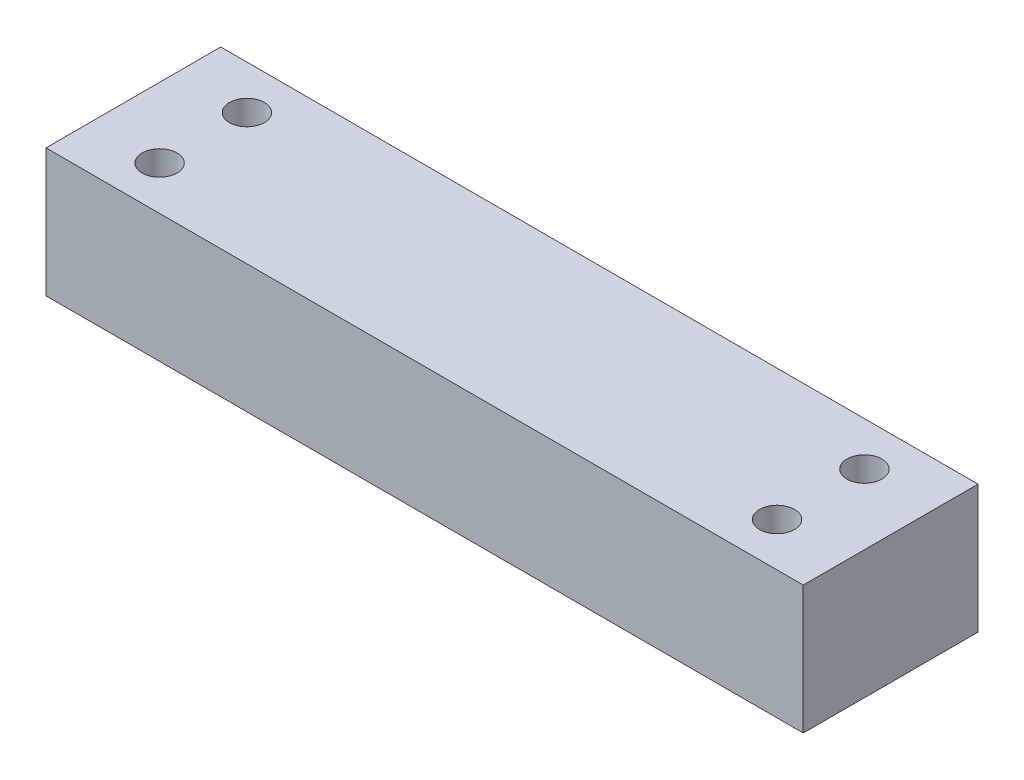
ISO-10303-21;
HEADER;
FILE_DESCRIPTION(('STEP AP214'),'2;1');
FILE_NAME('part.step','',(''),(''),'','','');
FILE_SCHEMA(('AUTOMOTIVE_DESIGN { 1 0 10303 214 1 1 1 1 }'));
ENDSEC;
DATA;
#1=APPLICATION_CONTEXT('core data for automotive mechanical design processes');
#2=APPLICATION_PROTOCOL_DEFINITION('international standard','automotive_design',2000,#1);
#3=PRODUCT_CONTEXT('',#1,'mechanical');
#4=PRODUCT('Part','Part','',(#3));
#5=PRODUCT_RELATED_PRODUCT_CATEGORY('part','',(#4));
#6=PRODUCT_DEFINITION_FORMATION('','',#4);
#7=PRODUCT_DEFINITION_CONTEXT('part definition',#1,'design');
#8=PRODUCT_DEFINITION('design','',#6,#7);
#9=PRODUCT_DEFINITION_SHAPE('','',#8);
#10=(LENGTH_UNIT() NAMED_UNIT(*) SI_UNIT(.MILLI.,.METRE.));
#11=(NAMED_UNIT(*) PLANE_ANGLE_UNIT() SI_UNIT($,.RADIAN.));
#12=(NAMED_UNIT(*) SI_UNIT($,.STERADIAN.) SOLID_ANGLE_UNIT());
#13=UNCERTAINTY_MEASURE_WITH_UNIT(LENGTH_MEASURE(1.E-05),#10,'distance_accuracy_value','');
#14=(GEOMETRIC_REPRESENTATION_CONTEXT(3) GLOBAL_UNCERTAINTY_ASSIGNED_CONTEXT((#13)) GLOBAL_UNIT_ASSIGNED_CONTEXT((#10,
#11,#12)) REPRESENTATION_CONTEXT('',''));
#15=CARTESIAN_POINT('',(0.,0.,0.));
#16=DIRECTION('',(0.,0.,1.));
#17=DIRECTION('',(1.,0.,0.));
#18=AXIS2_PLACEMENT_3D('',#15,#16,#17);
#19=CARTESIAN_POINT('',(0.,22.,0.));
#20=DIRECTION('',(0.,1.,0.));
#21=DIRECTION('',(0.,0.,1.));
#22=AXIS2_PLACEMENT_3D('',#19,#20,#21);
#23=PLANE('',#22);
#24=CARTESIAN_POINT('',(53.,22.,-7.5));
#25=DIRECTION('',(0.,1.,0.));
#26=DIRECTION('',(0.,0.,1.));
#27=AXIS2_PLACEMENT_3D('',#24,#25,#26);
#28=CIRCLE('',#27,3.);
#29=CARTESIAN_POINT('',(53.,22.,-4.5));
#30=VERTEX_POINT('',#29);
#31=EDGE_CURVE('E121',#30,#30,#28,.T.);
#32=ORIENTED_EDGE('',*,*,#31,.F.);
#33=EDGE_LOOP('',(#32));
#34=FACE_BOUND('',#33,.T.);
#35=CARTESIAN_POINT('',(-53.,22.,-7.5));
#36=DIRECTION('',(0.,1.,0.));
#37=DIRECTION('',(0.,0.,1.));
#38=AXIS2_PLACEMENT_3D('',#35,#36,#37);
#39=CIRCLE('',#38,3.);
#40=CARTESIAN_POINT('',(-53.,22.,-4.5));
#41=VERTEX_POINT('',#40);
#42=EDGE_CURVE('E100',#41,#41,#39,.T.);
#43=ORIENTED_EDGE('',*,*,#42,.F.);
#44=EDGE_LOOP('',(#43));
#45=FACE_BOUND('',#44,.T.);
#46=DIRECTION('',(0.,0.,1.));
#47=VECTOR('',#46,1.);
#48=CARTESIAN_POINT('',(-65.,22.,-15.));
#49=LINE('',#48,#47);
#50=CARTESIAN_POINT('',(-65.,22.,-15.));
#51=VERTEX_POINT('',#50);
#52=CARTESIAN_POINT('',(-65.,22.,15.));
#53=VERTEX_POINT('',#52);
#54=EDGE_CURVE('E85',#51,#53,#49,.T.);
#55=ORIENTED_EDGE('',*,*,#54,.T.);
#56=DIRECTION('',(1.,0.,0.));
#57=VECTOR('',#56,1.);
#58=CARTESIAN_POINT('',(-65.,22.,15.));
#59=LINE('',#58,#57);
#60=CARTESIAN_POINT('',(65.,22.,15.));
#61=VERTEX_POINT('',#60);
#62=EDGE_CURVE('E80',#53,#61,#59,.T.);
#63=ORIENTED_EDGE('',*,*,#62,.T.);
#64=DIRECTION('',(0.,0.,-1.));
#65=VECTOR('',#64,1.);
#66=CARTESIAN_POINT('',(65.,22.,-15.));
#67=LINE('',#66,#65);
#68=CARTESIAN_POINT('',(65.,22.,-15.));
#69=VERTEX_POINT('',#68);
#70=EDGE_CURVE('E83',#61,#69,#67,.T.);
#71=ORIENTED_EDGE('',*,*,#70,.T.);
#72=DIRECTION('',(-1.,0.,0.));
#73=VECTOR('',#72,1.);
#74=CARTESIAN_POINT('',(-65.,22.,-15.));
#75=LINE('',#74,#73);
#76=EDGE_CURVE('E50',#69,#51,#75,.T.);
#77=ORIENTED_EDGE('',*,*,#76,.T.);
#78=EDGE_LOOP('',(#55,#63,#71,#77));
#79=FACE_BOUND('',#78,.T.);
#80=CARTESIAN_POINT('',(-53.,22.,7.5));
#81=DIRECTION('',(0.,1.,0.));
#82=DIRECTION('',(0.,0.,1.));
#83=AXIS2_PLACEMENT_3D('',#80,#81,#82);
#84=CIRCLE('',#83,3.);
#85=CARTESIAN_POINT('',(-53.,22.,10.5));
#86=VERTEX_POINT('',#85);
#87=EDGE_CURVE('E115',#86,#86,#84,.T.);
#88=ORIENTED_EDGE('',*,*,#87,.F.);
#89=EDGE_LOOP('',(#88));
#90=FACE_BOUND('',#89,.T.);
#91=CARTESIAN_POINT('',(53.,22.,7.5));
#92=DIRECTION('',(0.,1.,0.));
#93=DIRECTION('',(0.,0.,1.));
#94=AXIS2_PLACEMENT_3D('',#91,#92,#93);
#95=CIRCLE('',#94,3.);
#96=CARTESIAN_POINT('',(53.,22.,10.5));
#97=VERTEX_POINT('',#96);
#98=EDGE_CURVE('E127',#97,#97,#95,.T.);
#99=ORIENTED_EDGE('',*,*,#98,.F.);
#100=EDGE_LOOP('',(#99));
#101=FACE_BOUND('',#100,.T.);
#102=ADVANCED_FACE('F33',(#34,#45,#79,#90,#101),#23,.T.);
#103=CARTESIAN_POINT('',(0.,0.,0.));
#104=DIRECTION('',(0.,1.,0.));
#105=DIRECTION('',(0.,0.,1.));
#106=AXIS2_PLACEMENT_3D('',#103,#104,#105);
#107=PLANE('',#106);
#108=DIRECTION('',(0.,0.,1.));
#109=VECTOR('',#108,1.);
#110=CARTESIAN_POINT('',(-65.,0.,-15.));
#111=LINE('',#110,#109);
#112=CARTESIAN_POINT('',(-65.,0.,-15.));
#113=VERTEX_POINT('',#112);
#114=CARTESIAN_POINT('',(-65.,0.,15.));
#115=VERTEX_POINT('',#114);
#116=EDGE_CURVE('E97',#113,#115,#111,.T.);
#117=ORIENTED_EDGE('',*,*,#116,.F.);
#118=DIRECTION('',(-1.,0.,0.));
#119=VECTOR('',#118,1.);
#120=CARTESIAN_POINT('',(-65.,0.,-15.));
#121=LINE('',#120,#119);
#122=CARTESIAN_POINT('',(65.,0.,-15.));
#123=VERTEX_POINT('',#122);
#124=EDGE_CURVE('E73',#123,#113,#121,.T.);
#125=ORIENTED_EDGE('',*,*,#124,.F.);
#126=DIRECTION('',(0.,0.,-1.));
#127=VECTOR('',#126,1.);
#128=CARTESIAN_POINT('',(65.,0.,-15.));
#129=LINE('',#128,#127);
#130=CARTESIAN_POINT('',(65.,0.,15.));
#131=VERTEX_POINT('',#130);
#132=EDGE_CURVE('E67',#131,#123,#129,.T.);
#133=ORIENTED_EDGE('',*,*,#132,.F.);
#134=DIRECTION('',(1.,0.,0.));
#135=VECTOR('',#134,1.);
#136=CARTESIAN_POINT('',(-65.,0.,15.));
#137=LINE('',#136,#135);
#138=EDGE_CURVE('E89',#115,#131,#137,.T.);
#139=ORIENTED_EDGE('',*,*,#138,.F.);
#140=EDGE_LOOP('',(#117,#125,#133,#139));
#141=FACE_BOUND('',#140,.T.);
#142=CARTESIAN_POINT('',(-53.,0.,-7.5));
#143=DIRECTION('',(0.,1.,0.));
#144=DIRECTION('',(0.,0.,1.));
#145=AXIS2_PLACEMENT_3D('',#142,#143,#144);
#146=CIRCLE('',#145,3.);
#147=CARTESIAN_POINT('',(-53.,0.,-4.5));
#148=VERTEX_POINT('',#147);
#149=EDGE_CURVE('E112',#148,#148,#146,.T.);
#150=ORIENTED_EDGE('',*,*,#149,.T.);
#151=EDGE_LOOP('',(#150));
#152=FACE_BOUND('',#151,.T.);
#153=CARTESIAN_POINT('',(-53.,0.,7.5));
#154=DIRECTION('',(0.,1.,0.));
#155=DIRECTION('',(0.,0.,1.));
#156=AXIS2_PLACEMENT_3D('',#153,#154,#155);
#157=CIRCLE('',#156,3.);
#158=CARTESIAN_POINT('',(-53.,0.,10.5));
#159=VERTEX_POINT('',#158);
#160=EDGE_CURVE('E118',#159,#159,#157,.T.);
#161=ORIENTED_EDGE('',*,*,#160,.T.);
#162=EDGE_LOOP('',(#161));
#163=FACE_BOUND('',#162,.T.);
#164=CARTESIAN_POINT('',(53.,0.,-7.5));
#165=DIRECTION('',(0.,1.,0.));
#166=DIRECTION('',(0.,0.,1.));
#167=AXIS2_PLACEMENT_3D('',#164,#165,#166);
#168=CIRCLE('',#167,3.);
#169=CARTESIAN_POINT('',(53.,0.,-4.5));
#170=VERTEX_POINT('',#169);
#171=EDGE_CURVE('E124',#170,#170,#168,.T.);
#172=ORIENTED_EDGE('',*,*,#171,.T.);
#173=EDGE_LOOP('',(#172));
#174=FACE_BOUND('',#173,.T.);
#175=CARTESIAN_POINT('',(53.,0.,7.5));
#176=DIRECTION('',(0.,1.,0.));
#177=DIRECTION('',(0.,0.,1.));
#178=AXIS2_PLACEMENT_3D('',#175,#176,#177);
#179=CIRCLE('',#178,3.);
#180=CARTESIAN_POINT('',(53.,0.,10.5));
#181=VERTEX_POINT('',#180);
#182=EDGE_CURVE('E130',#181,#181,#179,.T.);
#183=ORIENTED_EDGE('',*,*,#182,.T.);
#184=EDGE_LOOP('',(#183));
#185=FACE_BOUND('',#184,.T.);
#186=ADVANCED_FACE('F108',(#141,#152,#163,#174,#185),#107,.F.);
#187=CARTESIAN_POINT('',(-65.,22.,-15.));
#188=DIRECTION('',(1.,0.,0.));
#189=DIRECTION('',(0.,0.,-1.));
#190=AXIS2_PLACEMENT_3D('',#187,#188,#189);
#191=PLANE('',#190);
#192=ORIENTED_EDGE('',*,*,#116,.T.);
#193=DIRECTION('',(0.,-1.,0.));
#194=VECTOR('',#193,1.);
#195=CARTESIAN_POINT('',(-65.,22.,15.));
#196=LINE('',#195,#194);
#197=EDGE_CURVE('E11',#53,#115,#196,.T.);
#198=ORIENTED_EDGE('',*,*,#197,.F.);
#199=ORIENTED_EDGE('',*,*,#54,.F.);
#200=DIRECTION('',(0.,-1.,0.));
#201=VECTOR('',#200,1.);
#202=CARTESIAN_POINT('',(-65.,22.,-15.));
#203=LINE('',#202,#201);
#204=EDGE_CURVE('E93',#51,#113,#203,.T.);
#205=ORIENTED_EDGE('',*,*,#204,.T.);
#206=EDGE_LOOP('',(#192,#198,#199,#205));
#207=FACE_BOUND('',#206,.T.);
#208=ADVANCED_FACE('F35',(#207),#191,.F.);
#209=CARTESIAN_POINT('',(-65.,22.,15.));
#210=DIRECTION('',(0.,0.,-1.));
#211=DIRECTION('',(-1.,0.,0.));
#212=AXIS2_PLACEMENT_3D('',#209,#210,#211);
#213=PLANE('',#212);
#214=ORIENTED_EDGE('',*,*,#138,.T.);
#215=DIRECTION('',(0.,-1.,0.));
#216=VECTOR('',#215,1.);
#217=CARTESIAN_POINT('',(65.,22.,15.));
#218=LINE('',#217,#216);
#219=EDGE_CURVE('E42',#61,#131,#218,.T.);
#220=ORIENTED_EDGE('',*,*,#219,.F.);
#221=ORIENTED_EDGE('',*,*,#62,.F.);
#222=ORIENTED_EDGE('',*,*,#197,.T.);
#223=EDGE_LOOP('',(#214,#220,#221,#222));
#224=FACE_BOUND('',#223,.T.);
#225=ADVANCED_FACE('F88',(#224),#213,.F.);
#226=CARTESIAN_POINT('',(65.,22.,-15.));
#227=DIRECTION('',(-1.,0.,0.));
#228=DIRECTION('',(0.,0.,1.));
#229=AXIS2_PLACEMENT_3D('',#226,#227,#228);
#230=PLANE('',#229);
#231=ORIENTED_EDGE('',*,*,#132,.T.);
#232=DIRECTION('',(0.,-1.,0.));
#233=VECTOR('',#232,1.);
#234=CARTESIAN_POINT('',(65.,22.,-15.));
#235=LINE('',#234,#233);
#236=EDGE_CURVE('E90',#69,#123,#235,.T.);
#237=ORIENTED_EDGE('',*,*,#236,.F.);
#238=ORIENTED_EDGE('',*,*,#70,.F.);
#239=ORIENTED_EDGE('',*,*,#219,.T.);
#240=EDGE_LOOP('',(#231,#237,#238,#239));
#241=FACE_BOUND('',#240,.T.);
#242=ADVANCED_FACE('F91',(#241),#230,.F.);
#243=CARTESIAN_POINT('',(-65.,22.,-15.));
#244=DIRECTION('',(0.,0.,1.));
#245=DIRECTION('',(1.,0.,0.));
#246=AXIS2_PLACEMENT_3D('',#243,#244,#245);
#247=PLANE('',#246);
#248=ORIENTED_EDGE('',*,*,#124,.T.);
#249=ORIENTED_EDGE('',*,*,#204,.F.);
#250=ORIENTED_EDGE('',*,*,#76,.F.);
#251=ORIENTED_EDGE('',*,*,#236,.T.);
#252=EDGE_LOOP('',(#248,#249,#250,#251));
#253=FACE_BOUND('',#252,.T.);
#254=ADVANCED_FACE('F105',(#253),#247,.F.);
#255=CARTESIAN_POINT('',(-53.,22.,-7.5));
#256=DIRECTION('',(0.,-1.,0.));
#257=DIRECTION('',(0.,0.,-1.));
#258=AXIS2_PLACEMENT_3D('',#255,#256,#257);
#259=CYLINDRICAL_SURFACE('',#258,3.);
#260=ORIENTED_EDGE('',*,*,#42,.T.);
#261=EDGE_LOOP('',(#260));
#262=FACE_BOUND('',#261,.T.);
#263=ORIENTED_EDGE('',*,*,#149,.F.);
#264=EDGE_LOOP('',(#263));
#265=FACE_BOUND('',#264,.T.);
#266=ADVANCED_FACE('F149',(#262,#265),#259,.F.);
#267=CARTESIAN_POINT('',(-53.,22.,7.5));
#268=DIRECTION('',(0.,-1.,0.));
#269=DIRECTION('',(0.,0.,-1.));
#270=AXIS2_PLACEMENT_3D('',#267,#268,#269);
#271=CYLINDRICAL_SURFACE('',#270,3.);
#272=ORIENTED_EDGE('',*,*,#87,.T.);
#273=EDGE_LOOP('',(#272));
#274=FACE_BOUND('',#273,.T.);
#275=ORIENTED_EDGE('',*,*,#160,.F.);
#276=EDGE_LOOP('',(#275));
#277=FACE_BOUND('',#276,.T.);
#278=ADVANCED_FACE('F195',(#274,#277),#271,.F.);
#279=CARTESIAN_POINT('',(53.,22.,-7.5));
#280=DIRECTION('',(0.,-1.,0.));
#281=DIRECTION('',(0.,0.,-1.));
#282=AXIS2_PLACEMENT_3D('',#279,#280,#281);
#283=CYLINDRICAL_SURFACE('',#282,3.);
#284=ORIENTED_EDGE('',*,*,#31,.T.);
#285=EDGE_LOOP('',(#284));
#286=FACE_BOUND('',#285,.T.);
#287=ORIENTED_EDGE('',*,*,#171,.F.);
#288=EDGE_LOOP('',(#287));
#289=FACE_BOUND('',#288,.T.);
#290=ADVANCED_FACE('F203',(#286,#289),#283,.F.);
#291=CARTESIAN_POINT('',(53.,22.,7.5));
#292=DIRECTION('',(0.,-1.,0.));
#293=DIRECTION('',(0.,0.,-1.));
#294=AXIS2_PLACEMENT_3D('',#291,#292,#293);
#295=CYLINDRICAL_SURFACE('',#294,3.);
#296=ORIENTED_EDGE('',*,*,#98,.T.);
#297=EDGE_LOOP('',(#296));
#298=FACE_BOUND('',#297,.T.);
#299=ORIENTED_EDGE('',*,*,#182,.F.);
#300=EDGE_LOOP('',(#299));
#301=FACE_BOUND('',#300,.T.);
#302=ADVANCED_FACE('F136',(#298,#301),#295,.F.);
#303=CLOSED_SHELL('',(#102,#186,#208,#225,#242,#254,#266,#278,#290,#302));
#304=MANIFOLD_SOLID_BREP('B2',#303);
#305=ADVANCED_BREP_SHAPE_REPRESENTATION('',(#18,#304),#14);
#306=SHAPE_DEFINITION_REPRESENTATION(#9,#305);
ENDSEC;
END-ISO-10303-21;
